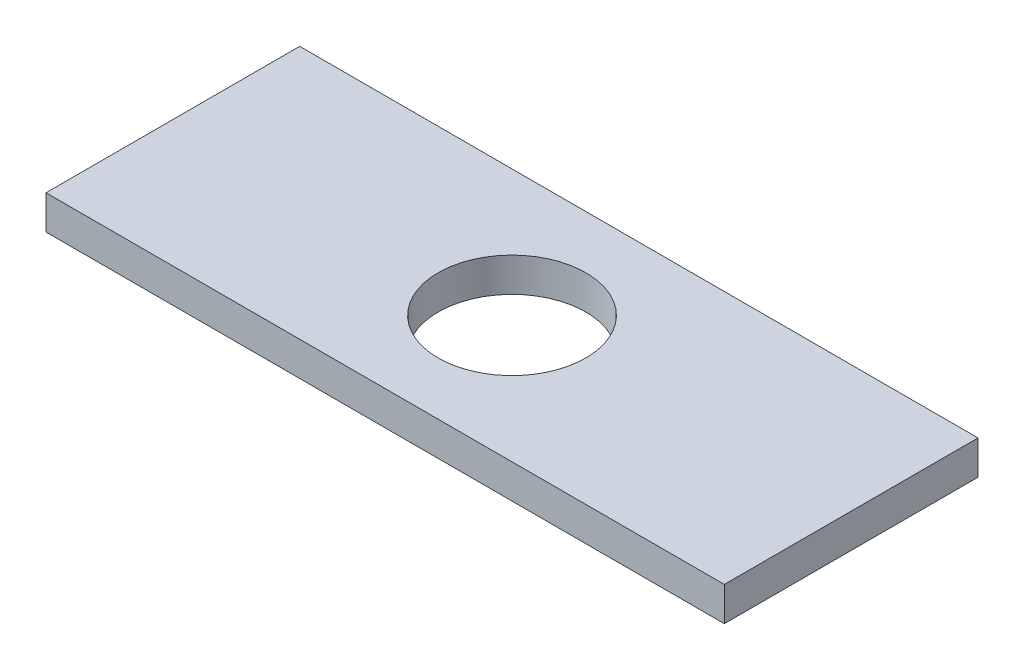
ISO-10303-21;
HEADER;
FILE_DESCRIPTION(('STEP AP214'),'2;1');
FILE_NAME('part.step','',(''),(''),'','','');
FILE_SCHEMA(('AUTOMOTIVE_DESIGN { 1 0 10303 214 1 1 1 1 }'));
ENDSEC;
DATA;
#1=APPLICATION_CONTEXT('core data for automotive mechanical design processes');
#2=APPLICATION_PROTOCOL_DEFINITION('international standard','automotive_design',2000,#1);
#3=PRODUCT_CONTEXT('',#1,'mechanical');
#4=PRODUCT('Part','Part','',(#3));
#5=PRODUCT_RELATED_PRODUCT_CATEGORY('part','',(#4));
#6=PRODUCT_DEFINITION_FORMATION('','',#4);
#7=PRODUCT_DEFINITION_CONTEXT('part definition',#1,'design');
#8=PRODUCT_DEFINITION('design','',#6,#7);
#9=PRODUCT_DEFINITION_SHAPE('','',#8);
#10=(LENGTH_UNIT() NAMED_UNIT(*) SI_UNIT(.MILLI.,.METRE.));
#11=(NAMED_UNIT(*) PLANE_ANGLE_UNIT() SI_UNIT($,.RADIAN.));
#12=(NAMED_UNIT(*) SI_UNIT($,.STERADIAN.) SOLID_ANGLE_UNIT());
#13=UNCERTAINTY_MEASURE_WITH_UNIT(LENGTH_MEASURE(1.E-05),#10,'distance_accuracy_value','');
#14=(GEOMETRIC_REPRESENTATION_CONTEXT(3) GLOBAL_UNCERTAINTY_ASSIGNED_CONTEXT((#13)) GLOBAL_UNIT_ASSIGNED_CONTEXT((#10,
#11,#12)) REPRESENTATION_CONTEXT('',''));
#15=CARTESIAN_POINT('',(0.,0.,0.));
#16=DIRECTION('',(0.,0.,1.));
#17=DIRECTION('',(1.,0.,0.));
#18=AXIS2_PLACEMENT_3D('',#15,#16,#17);
#19=CARTESIAN_POINT('',(149.49912925,15.,-55.9101827426069));
#20=DIRECTION('',(-1.,0.,0.));
#21=DIRECTION('',(0.,0.,1.));
#22=AXIS2_PLACEMENT_3D('',#19,#20,#21);
#23=PLANE('',#22);
#24=DIRECTION('',(0.,0.,-1.));
#25=VECTOR('',#24,1.);
#26=CARTESIAN_POINT('',(149.49912925,0.,-55.9101827426069));
#27=LINE('',#26,#25);
#28=CARTESIAN_POINT('',(149.49912925,0.,55.9101827426069));
#29=VERTEX_POINT('',#28);
#30=CARTESIAN_POINT('',(149.49912925,0.,-55.9101827426069));
#31=VERTEX_POINT('',#30);
#32=EDGE_CURVE('E96',#29,#31,#27,.T.);
#33=ORIENTED_EDGE('',*,*,#32,.T.);
#34=DIRECTION('',(0.,-1.,0.));
#35=VECTOR('',#34,1.);
#36=CARTESIAN_POINT('',(149.49912925,15.,-55.9101827426069));
#37=LINE('',#36,#35);
#38=CARTESIAN_POINT('',(149.49912925,15.,-55.9101827426069));
#39=VERTEX_POINT('',#38);
#40=EDGE_CURVE('E11',#39,#31,#37,.T.);
#41=ORIENTED_EDGE('',*,*,#40,.F.);
#42=DIRECTION('',(0.,0.,-1.));
#43=VECTOR('',#42,1.);
#44=CARTESIAN_POINT('',(149.49912925,15.,-55.9101827426069));
#45=LINE('',#44,#43);
#46=CARTESIAN_POINT('',(149.49912925,15.,55.9101827426069));
#47=VERTEX_POINT('',#46);
#48=EDGE_CURVE('E84',#47,#39,#45,.T.);
#49=ORIENTED_EDGE('',*,*,#48,.F.);
#50=DIRECTION('',(0.,-1.,0.));
#51=VECTOR('',#50,1.);
#52=CARTESIAN_POINT('',(149.49912925,15.,55.9101827426069));
#53=LINE('',#52,#51);
#54=EDGE_CURVE('E92',#47,#29,#53,.T.);
#55=ORIENTED_EDGE('',*,*,#54,.T.);
#56=EDGE_LOOP('',(#33,#41,#49,#55));
#57=FACE_BOUND('',#56,.T.);
#58=ADVANCED_FACE('F33',(#57),#23,.F.);
#59=CARTESIAN_POINT('',(-149.49912925,15.,-55.9101827426069));
#60=DIRECTION('',(0.,0.,1.));
#61=DIRECTION('',(1.,0.,0.));
#62=AXIS2_PLACEMENT_3D('',#59,#60,#61);
#63=PLANE('',#62);
#64=DIRECTION('',(-1.,0.,0.));
#65=VECTOR('',#64,1.);
#66=CARTESIAN_POINT('',(-149.49912925,0.,-55.9101827426069));
#67=LINE('',#66,#65);
#68=CARTESIAN_POINT('',(-149.49912925,0.,-55.9101827426069));
#69=VERTEX_POINT('',#68);
#70=EDGE_CURVE('E88',#31,#69,#67,.T.);
#71=ORIENTED_EDGE('',*,*,#70,.T.);
#72=DIRECTION('',(0.,-1.,0.));
#73=VECTOR('',#72,1.);
#74=CARTESIAN_POINT('',(-149.49912925,15.,-55.9101827426069));
#75=LINE('',#74,#73);
#76=CARTESIAN_POINT('',(-149.49912925,15.,-55.9101827426069));
#77=VERTEX_POINT('',#76);
#78=EDGE_CURVE('E41',#77,#69,#75,.T.);
#79=ORIENTED_EDGE('',*,*,#78,.F.);
#80=DIRECTION('',(-1.,0.,0.));
#81=VECTOR('',#80,1.);
#82=CARTESIAN_POINT('',(-149.49912925,15.,-55.9101827426069));
#83=LINE('',#82,#81);
#84=EDGE_CURVE('E79',#39,#77,#83,.T.);
#85=ORIENTED_EDGE('',*,*,#84,.F.);
#86=ORIENTED_EDGE('',*,*,#40,.T.);
#87=EDGE_LOOP('',(#71,#79,#85,#86));
#88=FACE_BOUND('',#87,.T.);
#89=ADVANCED_FACE('F87',(#88),#63,.F.);
#90=CARTESIAN_POINT('',(-149.49912925,15.,-55.9101827426069));
#91=DIRECTION('',(1.,0.,0.));
#92=DIRECTION('',(0.,0.,-1.));
#93=AXIS2_PLACEMENT_3D('',#90,#91,#92);
#94=PLANE('',#93);
#95=DIRECTION('',(0.,0.,1.));
#96=VECTOR('',#95,1.);
#97=CARTESIAN_POINT('',(-149.49912925,0.,-55.9101827426069));
#98=LINE('',#97,#96);
#99=CARTESIAN_POINT('',(-149.49912925,0.,55.9101827426069));
#100=VERTEX_POINT('',#99);
#101=EDGE_CURVE('E66',#69,#100,#98,.T.);
#102=ORIENTED_EDGE('',*,*,#101,.T.);
#103=DIRECTION('',(0.,-1.,0.));
#104=VECTOR('',#103,1.);
#105=CARTESIAN_POINT('',(-149.49912925,15.,55.9101827426069));
#106=LINE('',#105,#104);
#107=CARTESIAN_POINT('',(-149.49912925,15.,55.9101827426069));
#108=VERTEX_POINT('',#107);
#109=EDGE_CURVE('E89',#108,#100,#106,.T.);
#110=ORIENTED_EDGE('',*,*,#109,.F.);
#111=DIRECTION('',(0.,0.,1.));
#112=VECTOR('',#111,1.);
#113=CARTESIAN_POINT('',(-149.49912925,15.,-55.9101827426069));
#114=LINE('',#113,#112);
#115=EDGE_CURVE('E82',#77,#108,#114,.T.);
#116=ORIENTED_EDGE('',*,*,#115,.F.);
#117=ORIENTED_EDGE('',*,*,#78,.T.);
#118=EDGE_LOOP('',(#102,#110,#116,#117));
#119=FACE_BOUND('',#118,.T.);
#120=ADVANCED_FACE('F90',(#119),#94,.F.);
#121=CARTESIAN_POINT('',(-149.49912925,15.,55.9101827426069));
#122=DIRECTION('',(0.,0.,-1.));
#123=DIRECTION('',(-1.,0.,0.));
#124=AXIS2_PLACEMENT_3D('',#121,#122,#123);
#125=PLANE('',#124);
#126=DIRECTION('',(1.,0.,0.));
#127=VECTOR('',#126,1.);
#128=CARTESIAN_POINT('',(-149.49912925,0.,55.9101827426069));
#129=LINE('',#128,#127);
#130=EDGE_CURVE('E72',#100,#29,#129,.T.);
#131=ORIENTED_EDGE('',*,*,#130,.T.);
#132=ORIENTED_EDGE('',*,*,#54,.F.);
#133=DIRECTION('',(1.,0.,0.));
#134=VECTOR('',#133,1.);
#135=CARTESIAN_POINT('',(-149.49912925,15.,55.9101827426069));
#136=LINE('',#135,#134);
#137=EDGE_CURVE('E49',#108,#47,#136,.T.);
#138=ORIENTED_EDGE('',*,*,#137,.F.);
#139=ORIENTED_EDGE('',*,*,#109,.T.);
#140=EDGE_LOOP('',(#131,#132,#138,#139));
#141=FACE_BOUND('',#140,.T.);
#142=ADVANCED_FACE('F104',(#141),#125,.F.);
#143=CARTESIAN_POINT('',(0.,15.,0.));
#144=DIRECTION('',(0.,1.,0.));
#145=DIRECTION('',(0.,0.,1.));
#146=AXIS2_PLACEMENT_3D('',#143,#144,#145);
#147=PLANE('',#146);
#148=CARTESIAN_POINT('',(0.,15.,0.));
#149=DIRECTION('',(0.,1.,0.));
#150=DIRECTION('',(0.,0.,1.));
#151=AXIS2_PLACEMENT_3D('',#148,#149,#150);
#152=CIRCLE('',#151,32.55);
#153=CARTESIAN_POINT('',(0.,15.,32.55));
#154=VERTEX_POINT('',#153);
#155=EDGE_CURVE('E110',#154,#154,#152,.T.);
#156=ORIENTED_EDGE('',*,*,#155,.F.);
#157=EDGE_LOOP('',(#156));
#158=FACE_BOUND('',#157,.T.);
#159=ORIENTED_EDGE('',*,*,#48,.T.);
#160=ORIENTED_EDGE('',*,*,#84,.T.);
#161=ORIENTED_EDGE('',*,*,#115,.T.);
#162=ORIENTED_EDGE('',*,*,#137,.T.);
#163=EDGE_LOOP('',(#159,#160,#161,#162));
#164=FACE_BOUND('',#163,.T.);
#165=ADVANCED_FACE('F80',(#158,#164),#147,.T.);
#166=CARTESIAN_POINT('',(0.,0.,0.));
#167=DIRECTION('',(0.,1.,0.));
#168=DIRECTION('',(0.,0.,1.));
#169=AXIS2_PLACEMENT_3D('',#166,#167,#168);
#170=PLANE('',#169);
#171=CARTESIAN_POINT('',(0.,0.,0.));
#172=DIRECTION('',(0.,1.,0.));
#173=DIRECTION('',(0.,0.,1.));
#174=AXIS2_PLACEMENT_3D('',#171,#172,#173);
#175=CIRCLE('',#174,32.55);
#176=CARTESIAN_POINT('',(0.,0.,32.55));
#177=VERTEX_POINT('',#176);
#178=EDGE_CURVE('E99',#177,#177,#175,.T.);
#179=ORIENTED_EDGE('',*,*,#178,.T.);
#180=EDGE_LOOP('',(#179));
#181=FACE_BOUND('',#180,.T.);
#182=ORIENTED_EDGE('',*,*,#32,.F.);
#183=ORIENTED_EDGE('',*,*,#130,.F.);
#184=ORIENTED_EDGE('',*,*,#101,.F.);
#185=ORIENTED_EDGE('',*,*,#70,.F.);
#186=EDGE_LOOP('',(#182,#183,#184,#185));
#187=FACE_BOUND('',#186,.T.);
#188=ADVANCED_FACE('F107',(#181,#187),#170,.F.);
#189=CARTESIAN_POINT('',(0.,0.,0.));
#190=DIRECTION('',(0.,1.,0.));
#191=DIRECTION('',(0.,0.,1.));
#192=AXIS2_PLACEMENT_3D('',#189,#190,#191);
#193=CYLINDRICAL_SURFACE('',#192,32.55);
#194=ORIENTED_EDGE('',*,*,#178,.F.);
#195=EDGE_LOOP('',(#194));
#196=FACE_BOUND('',#195,.T.);
#197=ORIENTED_EDGE('',*,*,#155,.T.);
#198=EDGE_LOOP('',(#197));
#199=FACE_BOUND('',#198,.T.);
#200=ADVANCED_FACE('F117',(#196,#199),#193,.F.);
#201=CLOSED_SHELL('',(#58,#89,#120,#142,#165,#188,#200));
#202=MANIFOLD_SOLID_BREP('B2',#201);
#203=ADVANCED_BREP_SHAPE_REPRESENTATION('',(#18,#202),#14);
#204=SHAPE_DEFINITION_REPRESENTATION(#9,#203);
ENDSEC;
END-ISO-10303-21;
